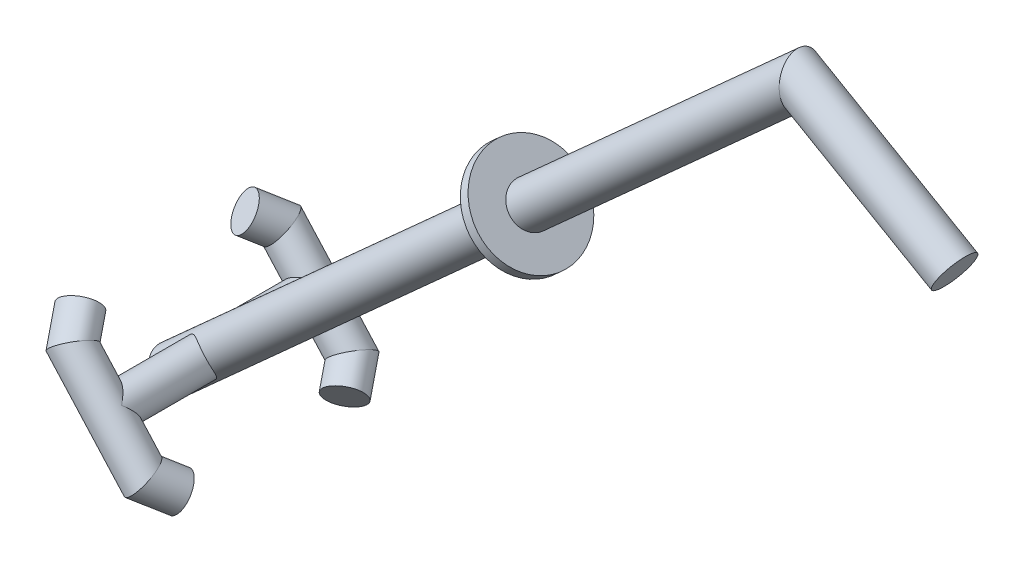
ISO-10303-21;
HEADER;
FILE_DESCRIPTION(('STEP AP214'),'2;1');
FILE_NAME('part.step','',(''),(''),'','','');
FILE_SCHEMA(('AUTOMOTIVE_DESIGN { 1 0 10303 214 1 1 1 1 }'));
ENDSEC;
DATA;
#1=APPLICATION_CONTEXT('core data for automotive mechanical design processes');
#2=APPLICATION_PROTOCOL_DEFINITION('international standard','automotive_design',2000,#1);
#3=PRODUCT_CONTEXT('',#1,'mechanical');
#4=PRODUCT('Part','Part','',(#3));
#5=PRODUCT_RELATED_PRODUCT_CATEGORY('part','',(#4));
#6=PRODUCT_DEFINITION_FORMATION('','',#4);
#7=PRODUCT_DEFINITION_CONTEXT('part definition',#1,'design');
#8=PRODUCT_DEFINITION('design','',#6,#7);
#9=PRODUCT_DEFINITION_SHAPE('','',#8);
#10=(LENGTH_UNIT() NAMED_UNIT(*) SI_UNIT(.MILLI.,.METRE.));
#11=(NAMED_UNIT(*) PLANE_ANGLE_UNIT() SI_UNIT($,.RADIAN.));
#12=(NAMED_UNIT(*) SI_UNIT($,.STERADIAN.) SOLID_ANGLE_UNIT());
#13=UNCERTAINTY_MEASURE_WITH_UNIT(LENGTH_MEASURE(1.E-05),#10,'distance_accuracy_value','');
#14=(GEOMETRIC_REPRESENTATION_CONTEXT(3) GLOBAL_UNCERTAINTY_ASSIGNED_CONTEXT((#13)) GLOBAL_UNIT_ASSIGNED_CONTEXT((#10,
#11,#12)) REPRESENTATION_CONTEXT('',''));
#15=CARTESIAN_POINT('',(0.,0.,0.));
#16=DIRECTION('',(0.,0.,1.));
#17=DIRECTION('',(1.,0.,0.));
#18=AXIS2_PLACEMENT_3D('',#15,#16,#17);
#19=CARTESIAN_POINT('',(249.156194685657,-78.6897357516122,0.));
#20=DIRECTION('',(0.743144825477398,0.669130606358854,0.));
#21=DIRECTION('',(-0.669130606358854,0.743144825477398,0.));
#22=AXIS2_PLACEMENT_3D('',#19,#20,#21);
#23=CYLINDRICAL_SURFACE('',#22,5.08);
#24=CARTESIAN_POINT('',(254.14913396922,-70.1917770508547,-4.11825515178776));
#25=CARTESIAN_POINT('',(254.149132988899,-70.4074317057948,-4.23399544106983));
#26=CARTESIAN_POINT('',(254.164807636791,-70.6261064364632,-4.3446819852995));
#27=CARTESIAN_POINT('',(254.23035109162,-71.0663901495953,-4.54956521334691));
#28=CARTESIAN_POINT('',(254.280237531761,-71.2880005873697,-4.64375336223393));
#29=CARTESIAN_POINT('',(254.406429938335,-71.6948219241537,-4.79613185379303));
#30=CARTESIAN_POINT('',(254.477475421224,-71.8803759449182,-4.85763355457012));
#31=CARTESIAN_POINT('',(254.604189290274,-72.1535314963265,-4.93432223758972));
#32=CARTESIAN_POINT('',(254.649788365544,-72.2437262923023,-4.95729211170676));
#33=CARTESIAN_POINT('',(254.747620127543,-72.4217209792447,-4.99763098139129));
#34=CARTESIAN_POINT('',(254.799849944904,-72.5095218862894,-5.01500238818462));
#35=CARTESIAN_POINT('',(254.911078754514,-72.6825141309198,-5.04387104270019));
#36=CARTESIAN_POINT('',(254.970117095992,-72.7676862826187,-5.05533181093221));
#37=CARTESIAN_POINT('',(255.094310882622,-72.934044596028,-5.0719590733311));
#38=CARTESIAN_POINT('',(255.159463687426,-73.0152324553805,-5.07712827097643));
#39=CARTESIAN_POINT('',(255.295405910486,-73.1729272994705,-5.08106003411351));
#40=CARTESIAN_POINT('',(255.366196055197,-73.2494336786769,-5.07982177259039));
#41=CARTESIAN_POINT('',(255.512772512572,-73.3970942734688,-5.07096634345174));
#42=CARTESIAN_POINT('',(255.588558535218,-73.4682487992235,-5.06334954581816));
#43=CARTESIAN_POINT('',(255.737369494736,-73.5985050226701,-5.04288271325791));
#44=CARTESIAN_POINT('',(255.810024685655,-73.6581148089143,-5.03056801628613));
#45=CARTESIAN_POINT('',(255.958331321872,-73.7721871008314,-5.00103688061268));
#46=CARTESIAN_POINT('',(256.033983747937,-73.8266479015565,-4.98381882581545));
#47=CARTESIAN_POINT('',(256.264562663344,-73.9819465653856,-4.92523611552475));
#48=CARTESIAN_POINT('',(256.423217065309,-74.0747929939041,-4.87692774682119));
#49=CARTESIAN_POINT('',(256.756960385078,-74.243965662488,-4.76097034074065));
#50=CARTESIAN_POINT('',(256.93243578093,-74.3187538594382,-4.69223595786027));
#51=CARTESIAN_POINT('',(257.285935834682,-74.4440493644646,-4.54086452555146));
#52=CARTESIAN_POINT('',(257.463960747671,-74.4945542251732,-4.45822607595045));
#53=CARTESIAN_POINT('',(257.776750088814,-74.563160005285,-4.30402267533324));
#54=CARTESIAN_POINT('',(257.91155814028,-74.586144830742,-4.2346172812231));
#55=CARTESIAN_POINT('',(258.18041779808,-74.6195543531291,-4.09144367080898));
#56=CARTESIAN_POINT('',(258.314469342059,-74.6299780293386,-4.01767510046362));
#57=CARTESIAN_POINT('',(258.582035188189,-74.6387870824467,-3.86687145047695));
#58=CARTESIAN_POINT('',(258.715542842412,-74.6371081464349,-3.7898210861157));
#59=CARTESIAN_POINT('',(258.981029772626,-74.6219023581932,-3.63441514086541));
#60=CARTESIAN_POINT('',(259.113009663555,-74.6083804536884,-3.55606011844181));
#61=CARTESIAN_POINT('',(259.378537289264,-74.5691246180855,-3.39795716931252));
#62=CARTESIAN_POINT('',(259.51205022472,-74.5431142993743,-3.31821916821371));
#63=CARTESIAN_POINT('',(259.777815060045,-74.4784597500726,-3.16147818485084));
#64=CARTESIAN_POINT('',(259.910065760249,-74.4398045349502,-3.08447764530976));
#65=CARTESIAN_POINT('',(260.172552784568,-74.3493926303415,-2.9370718973869));
#66=CARTESIAN_POINT('',(260.302796695252,-74.2977270793926,-2.86662529499108));
#67=CARTESIAN_POINT('',(260.562023717683,-74.1799645353021,-2.7366248519071));
#68=CARTESIAN_POINT('',(260.691008992462,-74.1138999626924,-2.67704708404071));
#69=CARTESIAN_POINT('',(260.929117401082,-73.9762208654124,-2.58266629456664));
#70=CARTESIAN_POINT('',(261.038491638038,-73.9066803960708,-2.5455617942469));
#71=CARTESIAN_POINT('',(261.253559322388,-73.7558502421392,-2.48981447264341));
#72=CARTESIAN_POINT('',(261.359263264086,-73.6745981968334,-2.47111395611796));
#73=CARTESIAN_POINT('',(261.564507711166,-73.5013122846726,-2.4556901934592));
#74=CARTESIAN_POINT('',(261.664002968959,-73.4092108428092,-2.45911270736234));
#75=CARTESIAN_POINT('',(261.852749329802,-73.2179308548708,-2.4875366217293));
#76=CARTESIAN_POINT('',(261.941977071841,-73.1187369712894,-2.51258617000328));
#77=CARTESIAN_POINT('',(262.137009130123,-72.8819455955973,-2.59106141318792));
#78=CARTESIAN_POINT('',(262.238081000754,-72.7427931577978,-2.65125302515248));
#79=CARTESIAN_POINT('',(262.420306023352,-72.4604520208135,-2.78984346841959));
#80=CARTESIAN_POINT('',(262.501386648994,-72.3172506667445,-2.86830664290075));
#81=CARTESIAN_POINT('',(262.635665113439,-72.0474396123349,-3.02334003538388));
#82=CARTESIAN_POINT('',(262.691161734895,-71.9212471777446,-3.09869468336642));
#83=CARTESIAN_POINT('',(262.7897184395,-71.6661612150275,-3.25302738685918));
#84=CARTESIAN_POINT('',(262.832770530119,-71.5372660077751,-3.33200773342121));
#85=CARTESIAN_POINT('',(262.906877949824,-71.2765125368304,-3.49110215910325));
#86=CARTESIAN_POINT('',(262.937916804624,-71.1446504647414,-3.57121764001123));
#87=CARTESIAN_POINT('',(262.987917050968,-70.8781235265312,-3.73048760870868));
#88=CARTESIAN_POINT('',(263.006881367221,-70.743459347307,-3.80964232465566));
#89=CARTESIAN_POINT('',(263.032867404201,-70.4667800330887,-3.96797751638083));
#90=CARTESIAN_POINT('',(263.039458669633,-70.3246709811525,-4.047066356909));
#91=CARTESIAN_POINT('',(263.038784636023,-70.037955361176,-4.20066571228135));
#92=CARTESIAN_POINT('',(263.031516079802,-69.893348213976,-4.27517514667779));
#93=CARTESIAN_POINT('',(263.002359283144,-69.6028899016629,-4.4175606618774));
#94=CARTESIAN_POINT('',(262.980519810637,-69.4570444832327,-4.48545800710331));
#95=CARTESIAN_POINT('',(262.921476146639,-69.1649637104576,-4.61296441578527));
#96=CARTESIAN_POINT('',(262.884283055522,-69.0187287135039,-4.67257942567887));
#97=CARTESIAN_POINT('',(262.78169046527,-68.6885984859833,-4.79611722464422));
#98=CARTESIAN_POINT('',(262.711428815208,-68.5049895410364,-4.85699723798752));
#99=CARTESIAN_POINT('',(262.586319294166,-68.2346388324491,-4.93308843013626));
#100=CARTESIAN_POINT('',(262.541319791724,-68.1453496576645,-4.95591683762551));
#101=CARTESIAN_POINT('',(262.444821571819,-67.9690979726654,-4.99609946976974));
#102=CARTESIAN_POINT('',(262.393325827991,-67.88213441984,-5.01345618643544));
#103=CARTESIAN_POINT('',(262.283706640348,-67.7107510213264,-5.042426523574));
#104=CARTESIAN_POINT('',(262.225546026034,-67.6263491275394,-5.05400579423735));
#105=CARTESIAN_POINT('',(262.103217322685,-67.4614118041529,-5.07101229641382));
#106=CARTESIAN_POINT('',(262.039051722828,-67.3808747932474,-5.07644206488803));
#107=CARTESIAN_POINT('',(261.905175519398,-67.2243478982543,-5.08103330442304));
#108=CARTESIAN_POINT('',(261.835464480749,-67.148358371768,-5.08019428317529));
#109=CARTESIAN_POINT('',(261.691108446513,-67.0015780107808,-5.07226666301542));
#110=CARTESIAN_POINT('',(261.616463693191,-66.9307869213739,-5.06517837075919));
#111=CARTESIAN_POINT('',(261.469102557252,-66.800396115456,-5.04572849160121));
#112=CARTESIAN_POINT('',(261.396714331204,-66.7403542307955,-5.0338371313628));
#113=CARTESIAN_POINT('',(261.248893415194,-66.6253980619588,-5.00512939151086));
#114=CARTESIAN_POINT('',(261.173459714131,-66.5704855011119,-4.9883113644493));
#115=CARTESIAN_POINT('',(260.943462773394,-66.4138131095829,-4.93088448329863));
#116=CARTESIAN_POINT('',(260.785100254932,-66.3200277364409,-4.88328864656311));
#117=CARTESIAN_POINT('',(260.452323764556,-66.1491987479334,-4.76884415678657));
#118=CARTESIAN_POINT('',(260.277532195739,-66.0736177990578,-4.70095505428218));
#119=CARTESIAN_POINT('',(259.925269918609,-65.9466424706373,-4.55119150054139));
#120=CARTESIAN_POINT('',(259.747798838019,-65.8952514844353,-4.46931508937414));
#121=CARTESIAN_POINT('',(259.43606547122,-65.8250678913967,-4.31644299098918));
#122=CARTESIAN_POINT('',(259.301779510705,-65.8013890721528,-4.24763570584447));
#123=CARTESIAN_POINT('',(259.033919652665,-65.7665254280234,-4.10560003140522));
#124=CARTESIAN_POINT('',(258.90034581419,-65.7553416236882,-4.03237128149527));
#125=CARTESIAN_POINT('',(258.633743455935,-65.7449412266344,-3.88259522111527));
#126=CARTESIAN_POINT('',(258.500721057382,-65.7457851038745,-3.80603307276504));
#127=CARTESIAN_POINT('',(258.236182496425,-65.7592347609078,-3.65149954236488));
#128=CARTESIAN_POINT('',(258.104665736212,-65.7718356961724,-3.57352875372511));
#129=CARTESIAN_POINT('',(257.840100329678,-65.8091157995216,-3.41607361830572));
#130=CARTESIAN_POINT('',(257.707085937286,-65.8340658844602,-3.33659566721231));
#131=CARTESIAN_POINT('',(257.442332375879,-65.8964429593232,-3.18014441247313));
#132=CARTESIAN_POINT('',(257.310594335945,-65.9338801132026,-3.10317320541633));
#133=CARTESIAN_POINT('',(257.049060604114,-66.0216819909266,-2.9554077747782));
#134=CARTESIAN_POINT('',(256.919257928806,-66.0719649124594,-2.88457812990505));
#135=CARTESIAN_POINT('',(256.660875741776,-66.1867219753314,-2.75322267207899));
#136=CARTESIAN_POINT('',(256.532294250761,-66.2511664510837,-2.69267578203751));
#137=CARTESIAN_POINT('',(256.293783804436,-66.3861765769136,-2.59528661043645));
#138=CARTESIAN_POINT('',(256.183638140403,-66.4548037681968,-2.55636776776374));
#139=CARTESIAN_POINT('',(255.966784168669,-66.6039833088675,-2.49665315582505));
#140=CARTESIAN_POINT('',(255.860066080076,-66.684497205065,-2.47580038418728));
#141=CARTESIAN_POINT('',(255.652358512358,-66.8567690747151,-2.45607512543866));
#142=CARTESIAN_POINT('',(255.551419290236,-66.9486086086704,-2.45737257634522));
#143=CARTESIAN_POINT('',(255.35969675135,-67.1397517425698,-2.48208887846352));
#144=CARTESIAN_POINT('',(255.268933134237,-67.2390692190518,-2.5055498375724));
#145=CARTESIAN_POINT('',(255.073494482125,-67.4727808769762,-2.57992768124749));
#146=CARTESIAN_POINT('',(254.973027661746,-67.6086295755826,-2.6370386741371));
#147=CARTESIAN_POINT('',(254.791285495913,-67.8844238428841,-2.76963599451193));
#148=CARTESIAN_POINT('',(254.710093694753,-68.0243843938411,-2.84519953360158));
#149=CARTESIAN_POINT('',(254.574607295624,-68.2890134284908,-2.99568122588813));
#150=CARTESIAN_POINT('',(254.518187430587,-68.4133017251703,-3.06940371437138));
#151=CARTESIAN_POINT('',(254.417557102453,-68.664506248945,-3.2207885622279));
#152=CARTESIAN_POINT('',(254.373356211788,-68.7914244531327,-3.2984539544423));
#153=CARTESIAN_POINT('',(254.296821291061,-69.0476777531446,-3.45493189409164));
#154=CARTESIAN_POINT('',(254.264461868656,-69.1770070449287,-3.53374160561353));
#155=CARTESIAN_POINT('',(254.211428785008,-69.4383326849929,-3.69068408481777));
#156=CARTESIAN_POINT('',(254.190746588806,-69.570327012102,-3.76881730571386));
#157=CARTESIAN_POINT('',(254.167133399462,-69.7840597143375,-3.89226182876939));
#158=CARTESIAN_POINT('',(254.160415494462,-69.8649712535567,-3.93830234650557));
#159=CARTESIAN_POINT('',(254.151415379655,-70.0277009248364,-4.02922559110284));
#160=CARTESIAN_POINT('',(254.149134343146,-70.1095192909499,-4.07410800861706));
#161=CARTESIAN_POINT('',(254.14913396922,-70.1917770508547,-4.11825515178776));
#162=B_SPLINE_CURVE_WITH_KNOTS('',3,(#24,#25,#26,#27,#28,#29,#30,#31,#32,#33,#34,#35,#36,#37,
#38,#39,#40,#41,#42,#43,#44,#45,#46,#47,#48,#49,#50,#51,#52,#53,#54,#55,#56,#57,#58,#59,#60,#61,
#62,#63,#64,#65,#66,#67,#68,#69,#70,#71,#72,#73,#74,#75,#76,#77,#78,#79,#80,#81,#82,#83,#84,#85,
#86,#87,#88,#89,#90,#91,#92,#93,#94,#95,#96,#97,#98,#99,#100,#101,#102,#103,#104,#105,#106,#107,
#108,#109,#110,#111,#112,#113,#114,#115,#116,#117,#118,#119,#120,#121,#122,#123,#124,#125,#126,
#127,#128,#129,#130,#131,#132,#133,#134,#135,#136,#137,#138,#139,#140,#141,#142,#143,#144,#145,
#146,#147,#148,#149,#150,#151,#152,#153,#154,#155,#156,#157,#158,#159,#160,#161),.UNSPECIFIED.,
.T.,.F.,(4,2,2,2,2,2,2,2,2,2,2,2,2,2,2,2,2,2,2,2,2,2,2,2,2,2,2,2,2,2,2,2,2,2,2,2,2,2,2,2,2,2,2,
2,2,2,2,2,2,2,2,2,2,2,2,2,2,2,2,2,2,2,2,2,2,2,2,2,4),(0.,0.733990146966119,1.46835888660772,
2.08948075071323,2.40008086523608,2.71054702684568,3.02290706927141,3.33513284361573,
3.6473989181471,3.95964688118591,4.2436672686794,4.52778137488264,5.09558974906912,
5.701723211818,6.30791775022142,6.76741938487248,7.2269583561689,7.68894109675736,
8.1507309233956,8.62324809182774,9.09617682749158,9.56588058700817,10.0345375001832,
10.437539651666,10.8392743555749,11.2436586187551,11.6489454823455,12.1925226937883,
12.738043855955,13.2087666063809,13.6797910112575,14.1514590834003,14.6230128640226,
15.1106879820713,15.5984777221067,16.0846429964925,16.5704573965552,17.184974741478,
17.4923472115677,17.7995794899266,18.1086172766732,18.4175275241927,18.7264620316983,
19.0353813804255,19.3194427131731,19.6035991429798,20.1715016447321,20.7758890552224,
21.3803612233041,21.8379947997396,22.295665751398,22.7556384819644,23.2154217631517,
23.6857713987629,24.1565048174992,24.6243122270545,25.0911488613091,25.4962101754357,
25.8999887294904,26.306866482902,26.7145188111379,27.2465828676837,27.7809125982518,
28.2457080445605,28.7108665896619,29.1750217408827,29.6388371974974,29.918731112026,
30.1986990324882),.UNSPECIFIED.);
#163=CARTESIAN_POINT('',(254.14913396922,-70.1917770508547,-4.11825515178776));
#164=VERTEX_POINT('',#163);
#165=EDGE_CURVE('E88',#164,#164,#162,.T.);
#166=ORIENTED_EDGE('',*,*,#165,.T.);
#167=EDGE_LOOP('',(#166));
#168=FACE_BOUND('',#167,.T.);
#169=CARTESIAN_POINT('',(334.097648237723,-2.20810744479509,0.));
#170=DIRECTION('',(-0.743144825477398,-0.669130606358854,0.));
#171=DIRECTION('',(0.669130606358854,-0.743144825477398,0.));
#172=AXIS2_PLACEMENT_3D('',#169,#170,#171);
#173=CIRCLE('',#172,5.08);
#174=CARTESIAN_POINT('',(337.496831718026,-5.98328315822027,0.));
#175=VERTEX_POINT('',#174);
#176=EDGE_CURVE('E111',#175,#175,#173,.F.);
#177=ORIENTED_EDGE('',*,*,#176,.F.);
#178=EDGE_LOOP('',(#177));
#179=FACE_BOUND('',#178,.T.);
#180=CARTESIAN_POINT('',(249.156194685657,-78.6897357516122,0.));
#181=DIRECTION('',(0.743144825477398,0.669130606358854,0.));
#182=DIRECTION('',(-0.669130606358854,0.743144825477398,0.));
#183=AXIS2_PLACEMENT_3D('',#180,#181,#182);
#184=CIRCLE('',#183,5.08);
#185=CARTESIAN_POINT('',(245.757011205354,-74.914560038187,0.));
#186=VERTEX_POINT('',#185);
#187=EDGE_CURVE('E102',#186,#186,#184,.T.);
#188=ORIENTED_EDGE('',*,*,#187,.T.);
#189=EDGE_LOOP('',(#188));
#190=FACE_BOUND('',#189,.T.);
#191=CARTESIAN_POINT('',(254.14913396922,-70.1917770508547,4.11825515178776));
#192=CARTESIAN_POINT('',(254.149132562831,-70.0244706407651,4.02845819541043));
#193=CARTESIAN_POINT('',(254.158564210281,-69.8588481848945,3.9355515307606));
#194=CARTESIAN_POINT('',(254.195367007206,-69.5314311486971,3.7462530048549));
#195=CARTESIAN_POINT('',(254.22275896489,-69.3696412341719,3.64985722376463));
#196=CARTESIAN_POINT('',(254.295125418143,-69.0501030404058,3.45670833090146));
#197=CARTESIAN_POINT('',(254.340112826029,-68.8923578201329,3.35995500851739));
#198=CARTESIAN_POINT('',(254.447985363836,-68.5809990044444,3.17017455098782));
#199=CARTESIAN_POINT('',(254.510847596268,-68.427380396656,3.07714282131856));
#200=CARTESIAN_POINT('',(254.645951671081,-68.1445937513569,2.91256470409574));
#201=CARTESIAN_POINT('',(254.715729369423,-68.0149587735245,2.83982082830173));
#202=CARTESIAN_POINT('',(254.871112093056,-67.7587779938306,2.70721445058392));
#203=CARTESIAN_POINT('',(254.956675672239,-67.6322250628098,2.64731908526395));
#204=CARTESIAN_POINT('',(255.127078773068,-67.4072768049769,2.55803158855024));
#205=CARTESIAN_POINT('',(255.208933157973,-67.3081214083116,2.52499790872944));
#206=CARTESIAN_POINT('',(255.38344205164,-67.1150384583928,2.47778512127265));
#207=CARTESIAN_POINT('',(255.476073588965,-67.0211003940856,2.4635666819497));
#208=CARTESIAN_POINT('',(255.670271919178,-66.8411598548282,2.45674667095494));
#209=CARTESIAN_POINT('',(255.771874917657,-66.7551926999169,2.46423697147883));
#210=CARTESIAN_POINT('',(255.980180954119,-66.5941806624122,2.49945575524474));
#211=CARTESIAN_POINT('',(256.086893541673,-66.5191573832192,2.52722363510958));
#212=CARTESIAN_POINT('',(256.347921013297,-66.3517591598163,2.61321729600936));
#213=CARTESIAN_POINT('',(256.503368778219,-66.2653696848189,2.67934321383672));
#214=CARTESIAN_POINT('',(256.816238343898,-66.1140876550786,2.82955150527997));
#215=CARTESIAN_POINT('',(256.973665583501,-66.0492833856298,2.91370536545682));
#216=CARTESIAN_POINT('',(257.266043845461,-65.9474492045922,3.07746222100986));
#217=CARTESIAN_POINT('',(257.400774952872,-65.9076951145569,3.15581340202346));
#218=CARTESIAN_POINT('',(257.671754399216,-65.8412918148412,3.31554609312485));
#219=CARTESIAN_POINT('',(257.808003651861,-65.8146509877374,3.3969295058911));
#220=CARTESIAN_POINT('',(258.082093031773,-65.7741972404775,3.56012905412644));
#221=CARTESIAN_POINT('',(258.219932737728,-65.7603809986362,3.64194507202238));
#222=CARTESIAN_POINT('',(258.497123394075,-65.7456701074006,3.80398933965463));
#223=CARTESIAN_POINT('',(258.636473718654,-65.7447702974742,3.88421821071262));
#224=CARTESIAN_POINT('',(259.009677254965,-65.7600935996277,4.09363716727147));
#225=CARTESIAN_POINT('',(259.244826433041,-65.7880860779514,4.21995540447049));
#226=CARTESIAN_POINT('',(259.71544436014,-65.8838604527059,4.4552762773978));
#227=CARTESIAN_POINT('',(259.950911566271,-65.951563831447,4.56431254470644));
#228=CARTESIAN_POINT('',(260.367266360204,-66.1110179977002,4.73651058083457));
#229=CARTESIAN_POINT('',(260.549191749936,-66.1946861285102,4.80449747864895));
#230=CARTESIAN_POINT('',(260.815806631671,-66.3404792913797,4.8912640987162));
#231=CARTESIAN_POINT('',(260.903656577974,-66.3924763416352,4.91765597142562));
#232=CARTESIAN_POINT('',(261.076580802039,-66.5031455431853,4.96488719519569));
#233=CARTESIAN_POINT('',(261.161656266281,-66.5618147917067,4.98572894777626));
#234=CARTESIAN_POINT('',(261.328871376144,-66.6860443490624,5.02155585683822));
#235=CARTESIAN_POINT('',(261.410986630671,-66.7516495364537,5.03649948573911));
#236=CARTESIAN_POINT('',(261.570834467473,-66.888994081624,5.05998152570235));
#237=CARTESIAN_POINT('',(261.648569024496,-66.9607306381775,5.0685228445325));
#238=CARTESIAN_POINT('',(261.798929422861,-67.1098104396779,5.07900637439937));
#239=CARTESIAN_POINT('',(261.871555725685,-67.187153176875,5.08094918230007));
#240=CARTESIAN_POINT('',(262.011028121827,-67.346765508024,5.07819011005758));
#241=CARTESIAN_POINT('',(262.077874654705,-67.4290347265037,5.07348873568545));
#242=CARTESIAN_POINT('',(262.198717743463,-67.5890861711293,5.05837203983206));
#243=CARTESIAN_POINT('',(262.253329223211,-67.6664655479434,5.04859094146473));
#244=CARTESIAN_POINT('',(262.357178081106,-67.82398495739,5.02395921452845));
#245=CARTESIAN_POINT('',(262.406413773906,-67.9041258454754,5.00910700211814));
#246=CARTESIAN_POINT('',(262.54570501519,-68.1477574216115,4.95732075851606));
#247=CARTESIAN_POINT('',(262.62743798287,-68.3145814277496,4.91314481262067));
#248=CARTESIAN_POINT('',(262.77128904317,-68.6600814178656,4.80594486547958));
#249=CARTESIAN_POINT('',(262.832343629038,-68.8389510744837,4.7421537345546));
#250=CARTESIAN_POINT('',(262.930493498901,-69.1975062612183,4.60018878995742));
#251=CARTESIAN_POINT('',(262.967581646083,-69.3771920183301,4.52201070098118));
#252=CARTESIAN_POINT('',(263.012822562134,-69.6901398986602,4.37568185598623));
#253=CARTESIAN_POINT('',(263.025876383915,-69.8238386674391,4.30986941909934));
#254=CARTESIAN_POINT('',(263.0399462668,-70.0894789721856,4.17356559868829));
#255=CARTESIAN_POINT('',(263.040961354808,-70.2214203652428,4.10307383739536));
#256=CARTESIAN_POINT('',(263.031494476033,-70.4835459243553,3.95853022500082));
#257=CARTESIAN_POINT('',(263.020968650799,-70.6137214705099,3.88446582272981));
#258=CARTESIAN_POINT('',(262.988770664266,-70.871532568411,3.7344485648133));
#259=CARTESIAN_POINT('',(262.967100714771,-70.9991686189584,3.65849608674472));
#260=CARTESIAN_POINT('',(262.912213008923,-71.2546345217465,3.50454125927876));
#261=CARTESIAN_POINT('',(262.878752047127,-71.3824070448688,3.42653053013483));
#262=CARTESIAN_POINT('',(262.800262616286,-71.6354059786244,3.27201020750456));
#263=CARTESIAN_POINT('',(262.755227409803,-71.7606308602875,3.19550151637946));
#264=CARTESIAN_POINT('',(262.65328740682,-72.0081324645772,3.04688812667179));
#265=CARTESIAN_POINT('',(262.596430477697,-72.1304189233794,2.97476713912211));
#266=CARTESIAN_POINT('',(262.469836120215,-72.3725085722169,2.83829516982085));
#267=CARTESIAN_POINT('',(262.400117474364,-72.4923151036396,2.77393308116909));
#268=CARTESIAN_POINT('',(262.253101693437,-72.718946271779,2.66322335777811));
#269=CARTESIAN_POINT('',(262.176990148889,-72.8259940911809,2.6157961200825));
#270=CARTESIAN_POINT('',(262.012368108561,-73.0363221668216,2.53738781603041));
#271=CARTESIAN_POINT('',(261.923894292417,-73.1396124689533,2.50635935064629));
#272=CARTESIAN_POINT('',(261.734081847058,-73.3410701728588,2.46593494399757));
#273=CARTESIAN_POINT('',(261.632601457548,-73.4391611391186,2.4568033169072));
#274=CARTESIAN_POINT('',(261.421122420861,-73.6248515288852,2.46314271455151));
#275=CARTESIAN_POINT('',(261.311118495951,-73.7124443651295,2.47862910033621));
#276=CARTESIAN_POINT('',(261.069923696171,-73.8869017518056,2.53461655002834));
#277=CARTESIAN_POINT('',(260.938046507596,-73.9716484989239,2.57854966496938));
#278=CARTESIAN_POINT('',(260.67195207087,-74.1242592826333,2.68524837762317));
#279=CARTESIAN_POINT('',(260.537727874989,-74.1920584661001,2.7480843502327));
#280=CARTESIAN_POINT('',(260.285331321874,-74.304494395121,2.87618339007785));
#281=CARTESIAN_POINT('',(260.167282451965,-74.3509783020937,2.94012762229087));
#282=CARTESIAN_POINT('',(259.930191335122,-74.4330889589353,3.07308523325851));
#283=CARTESIAN_POINT('',(259.811148424998,-74.4687077458749,3.14210228407681));
#284=CARTESIAN_POINT('',(259.571795318331,-74.5296880913547,3.28279138612159));
#285=CARTESIAN_POINT('',(259.451483537274,-74.5550347330619,3.35446713463571));
#286=CARTESIAN_POINT('',(259.209648832828,-74.5956608850891,3.49853815745945));
#287=CARTESIAN_POINT('',(259.088126231822,-74.6109430060391,3.57093324023179));
#288=CARTESIAN_POINT('',(258.834981521259,-74.6321928271128,3.72020837779463));
#289=CARTESIAN_POINT('',(258.703263579018,-74.6374085578132,3.79703496459467));
#290=CARTESIAN_POINT('',(258.438488562907,-74.6360238491249,3.94831710359834));
#291=CARTESIAN_POINT('',(258.305431237172,-74.6294211444323,4.02277219846102));
#292=CARTESIAN_POINT('',(258.038666481555,-74.6039621536895,4.16766882297589));
#293=CARTESIAN_POINT('',(257.904961286578,-74.5851344331073,4.23811929369125));
#294=CARTESIAN_POINT('',(257.637289119832,-74.5347075692957,4.37370467915152));
#295=CARTESIAN_POINT('',(257.503322152568,-74.5031086439161,4.43883968454422));
#296=CARTESIAN_POINT('',(257.175491520435,-74.4091392596493,4.59021179978349));
#297=CARTESIAN_POINT('',(256.981882663014,-74.3393173807312,4.67270557166519));
#298=CARTESIAN_POINT('',(256.695922691932,-74.2124402515016,4.78184665297454));
#299=CARTESIAN_POINT('',(256.601317851044,-74.1664404284564,4.81580155915348));
#300=CARTESIAN_POINT('',(256.414259707147,-74.0670025265051,4.87825325299601));
#301=CARTESIAN_POINT('',(256.321805344409,-74.0135682059236,4.90675278130219));
#302=CARTESIAN_POINT('',(256.138999569538,-73.8988101290985,4.95794972289073));
#303=CARTESIAN_POINT('',(256.048674803079,-73.837419273402,4.98059222305094));
#304=CARTESIAN_POINT('',(255.87193694863,-73.707412528951,5.01920639160371));
#305=CARTESIAN_POINT('',(255.785521871861,-73.6388003739749,5.03518148637181));
#306=CARTESIAN_POINT('',(255.617507864408,-73.4947995769799,5.06007279012822));
#307=CARTESIAN_POINT('',(255.535906884859,-73.4194138527436,5.06899202242062));
#308=CARTESIAN_POINT('',(255.378364167153,-73.2624783686783,5.07954669498464));
#309=CARTESIAN_POINT('',(255.302421711029,-73.1809293935112,5.0811830608764));
#310=CARTESIAN_POINT('',(255.166346668327,-73.0233316818362,5.07739465819352));
#311=CARTESIAN_POINT('',(255.105437889025,-72.9479285041577,5.07285270429826));
#312=CARTESIAN_POINT('',(254.988889323397,-72.7936200895622,5.0583053896487));
#313=CARTESIAN_POINT('',(254.933251193245,-72.7147137632282,5.04829831825067));
#314=CARTESIAN_POINT('',(254.827587637723,-72.5540626318585,5.02301539528633));
#315=CARTESIAN_POINT('',(254.777561193146,-72.472318345803,5.0077405025346));
#316=CARTESIAN_POINT('',(254.683292392235,-72.3065932416637,4.97220865473347));
#317=CARTESIAN_POINT('',(254.639052279187,-72.2226115712741,4.95194977617623));
#318=CARTESIAN_POINT('',(254.515239645017,-71.9683201189957,4.88422507366846));
#319=CARTESIAN_POINT('',(254.444458295489,-71.7954849776703,4.82978204151757));
#320=CARTESIAN_POINT('',(254.326268610991,-71.4476325423778,4.7056253266611));
#321=CARTESIAN_POINT('',(254.27885414196,-71.272615833478,4.6359156585615));
#322=CARTESIAN_POINT('',(254.210764389152,-70.9456368450468,4.49427973475413));
#323=CARTESIAN_POINT('',(254.187444074327,-70.7935899617051,4.42377830078619));
#324=CARTESIAN_POINT('',(254.156621238017,-70.4911744093303,4.27576359215637));
#325=CARTESIAN_POINT('',(254.149135221981,-70.3408076538306,4.19824308857481));
#326=CARTESIAN_POINT('',(254.14913396922,-70.1917770508547,4.11825515178776));
#327=B_SPLINE_CURVE_WITH_KNOTS('',3,(#191,#192,#193,#194,#195,#196,#197,#198,#199,#200,#201,
#202,#203,#204,#205,#206,#207,#208,#209,#210,#211,#212,#213,#214,#215,#216,#217,#218,#219,#220,
#221,#222,#223,#224,#225,#226,#227,#228,#229,#230,#231,#232,#233,#234,#235,#236,#237,#238,#239,
#240,#241,#242,#243,#244,#245,#246,#247,#248,#249,#250,#251,#252,#253,#254,#255,#256,#257,#258,
#259,#260,#261,#262,#263,#264,#265,#266,#267,#268,#269,#270,#271,#272,#273,#274,#275,#276,#277,
#278,#279,#280,#281,#282,#283,#284,#285,#286,#287,#288,#289,#290,#291,#292,#293,#294,#295,#296,
#297,#298,#299,#300,#301,#302,#303,#304,#305,#306,#307,#308,#309,#310,#311,#312,#313,#314,#315,
#316,#317,#318,#319,#320,#321,#322,#323,#324,#325,#326),.UNSPECIFIED.,.T.,.F.,(4,2,2,2,2,2,2,2,
2,2,2,2,2,2,2,2,2,2,2,2,2,2,2,2,2,2,2,2,2,2,2,2,2,2,2,2,2,2,2,2,2,2,2,2,2,2,2,2,2,2,2,2,2,2,2,2,
2,2,2,2,2,2,2,2,2,2,2,4),(0.,0.569405456438173,1.13947177526127,1.70995722113946,
2.27971514728834,2.77143173896167,3.26187523250785,3.65861353652608,4.05452117525026,
4.45210675320384,4.85046684884251,5.41647844485795,5.98477743467548,6.46671511066687,
6.94896046368854,7.43108087585526,7.91300865996652,8.71501603610783,9.51544297731459,
10.1470645559513,10.4630533497982,10.7789051932799,11.0969428291256,11.4148359326285,
11.7327002805525,12.0505404331846,12.3358424445797,12.6212336448777,13.1915537611311,
13.7878618515955,14.3843474310899,14.832555899227,15.2808005960054,15.7307546610688,
16.1806194570281,16.6403660756575,17.1003809241252,17.5585681852598,18.0160915580758,
18.4338437976107,18.8503818690993,19.2719231586664,19.6937275831577,20.1793891939863,
20.6668817714969,21.0925393842437,21.5185082114657,21.9450934174135,22.3715679280585,
22.8288266795343,23.2861730856657,23.7424546647633,24.1987284609933,24.8609254139073,
25.1922181111212,25.5233439360121,25.8574701075976,26.1914243598934,26.5252354414643,
26.8590040959109,27.1497588683714,27.4406047025778,27.7313976268317,28.0223029555718,
28.6034745975267,29.1844935942228,29.6911718400425,30.198377980353),.UNSPECIFIED.);
#328=CARTESIAN_POINT('',(254.14913396922,-70.1917770508547,4.11825515178776));
#329=VERTEX_POINT('',#328);
#330=EDGE_CURVE('E101',#329,#329,#327,.T.);
#331=ORIENTED_EDGE('',*,*,#330,.T.);
#332=EDGE_LOOP('',(#331));
#333=FACE_BOUND('',#332,.T.);
#334=ADVANCED_FACE('F39',(#168,#179,#190,#333),#23,.T.);
#335=CARTESIAN_POINT('',(401.431983116322,58.4199999999999,0.));
#336=DIRECTION('',(0.994521895368273,0.104528463267653,0.));
#337=DIRECTION('',(-0.104528463267653,0.994521895368273,0.));
#338=AXIS2_PLACEMENT_3D('',#335,#336,#337);
#339=ELLIPSE('',#338,6.27922532569891,5.08);
#340=CARTESIAN_POINT('',(400.775625342516,64.6648270723584,0.));
#341=VERTEX_POINT('',#340);
#342=EDGE_CURVE('E106',#341,#341,#339,.F.);
#343=ORIENTED_EDGE('',*,*,#342,.T.);
#344=EDGE_LOOP('',(#343));
#345=FACE_BOUND('',#344,.T.);
#346=CARTESIAN_POINT('',(335.985236094436,-0.508515704643595,0.));
#347=DIRECTION('',(-0.743144825477398,-0.669130606358854,0.));
#348=DIRECTION('',(0.669130606358854,-0.743144825477398,0.));
#349=AXIS2_PLACEMENT_3D('',#346,#347,#348);
#350=CIRCLE('',#349,5.08);
#351=CARTESIAN_POINT('',(339.384419574739,-4.28369141806878,0.));
#352=VERTEX_POINT('',#351);
#353=EDGE_CURVE('E96',#352,#352,#350,.F.);
#354=ORIENTED_EDGE('',*,*,#353,.T.);
#355=EDGE_LOOP('',(#354));
#356=FACE_BOUND('',#355,.T.);
#357=ADVANCED_FACE('F160',(#345,#356),#23,.T.);
#358=CARTESIAN_POINT('',(438.948942503816,36.7595733984546,0.));
#359=DIRECTION('',(0.866025403784441,-0.499999999999995,0.));
#360=DIRECTION('',(0.499999999999995,0.866025403784441,0.));
#361=AXIS2_PLACEMENT_3D('',#358,#359,#360);
#362=PLANE('',#361);
#363=CARTESIAN_POINT('',(438.948942503816,36.7595733984546,0.));
#364=DIRECTION('',(0.866025403784441,-0.499999999999995,0.));
#365=DIRECTION('',(0.499999999999995,0.866025403784441,0.));
#366=AXIS2_PLACEMENT_3D('',#363,#364,#365);
#367=CIRCLE('',#366,5.08);
#368=CARTESIAN_POINT('',(441.488942503816,41.1589824496796,0.));
#369=VERTEX_POINT('',#368);
#370=EDGE_CURVE('E107',#369,#369,#367,.T.);
#371=ORIENTED_EDGE('',*,*,#370,.T.);
#372=EDGE_LOOP('',(#371));
#373=FACE_BOUND('',#372,.T.);
#374=ADVANCED_FACE('F41',(#373),#362,.T.);
#375=CARTESIAN_POINT('',(397.829387024757,60.4999598232469,0.));
#376=DIRECTION('',(0.866025403784441,-0.499999999999995,0.));
#377=DIRECTION('',(0.499999999999995,0.866025403784441,0.));
#378=AXIS2_PLACEMENT_3D('',#375,#376,#377);
#379=CYLINDRICAL_SURFACE('',#378,5.08);
#380=ORIENTED_EDGE('',*,*,#342,.F.);
#381=EDGE_LOOP('',(#380));
#382=FACE_BOUND('',#381,.T.);
#383=ORIENTED_EDGE('',*,*,#370,.F.);
#384=EDGE_LOOP('',(#383));
#385=FACE_BOUND('',#384,.T.);
#386=ADVANCED_FACE('F154',(#382,#385),#379,.T.);
#387=CARTESIAN_POINT('',(334.097648237723,-2.20810744479499,0.));
#388=DIRECTION('',(0.743144825477398,0.669130606358854,0.));
#389=DIRECTION('',(-0.669130606358854,0.743144825477398,0.));
#390=AXIS2_PLACEMENT_3D('',#387,#388,#389);
#391=CYLINDRICAL_SURFACE('',#390,12.7);
#392=CARTESIAN_POINT('',(334.097648237723,-2.20810744479499,0.));
#393=DIRECTION('',(-0.743144825477398,-0.669130606358854,0.));
#394=DIRECTION('',(0.669130606358854,-0.743144825477398,0.));
#395=AXIS2_PLACEMENT_3D('',#392,#393,#394);
#396=CIRCLE('',#395,12.7);
#397=CARTESIAN_POINT('',(342.595606938481,-11.6460467283579,0.));
#398=VERTEX_POINT('',#397);
#399=EDGE_CURVE('E92',#398,#398,#396,.T.);
#400=ORIENTED_EDGE('',*,*,#399,.F.);
#401=EDGE_LOOP('',(#400));
#402=FACE_BOUND('',#401,.T.);
#403=CARTESIAN_POINT('',(335.985236094436,-0.508515704643497,0.));
#404=DIRECTION('',(-0.743144825477398,-0.669130606358854,0.));
#405=DIRECTION('',(0.669130606358854,-0.743144825477398,0.));
#406=AXIS2_PLACEMENT_3D('',#403,#404,#405);
#407=CIRCLE('',#406,12.7);
#408=CARTESIAN_POINT('',(344.483194795193,-9.94645498820645,0.));
#409=VERTEX_POINT('',#408);
#410=EDGE_CURVE('E97',#409,#409,#407,.T.);
#411=ORIENTED_EDGE('',*,*,#410,.T.);
#412=EDGE_LOOP('',(#411));
#413=FACE_BOUND('',#412,.T.);
#414=ADVANCED_FACE('F149',(#402,#413),#391,.T.);
#415=CARTESIAN_POINT('',(334.097648237723,-2.20810744479499,0.));
#416=DIRECTION('',(-0.743144825477398,-0.669130606358854,0.));
#417=DIRECTION('',(0.669130606358854,-0.743144825477398,0.));
#418=AXIS2_PLACEMENT_3D('',#415,#416,#417);
#419=PLANE('',#418);
#420=ORIENTED_EDGE('',*,*,#176,.T.);
#421=EDGE_LOOP('',(#420));
#422=FACE_BOUND('',#421,.T.);
#423=ORIENTED_EDGE('',*,*,#399,.T.);
#424=EDGE_LOOP('',(#423));
#425=FACE_BOUND('',#424,.T.);
#426=ADVANCED_FACE('F144',(#422,#425),#419,.T.);
#427=CARTESIAN_POINT('',(335.985236094436,-0.508515704643497,0.));
#428=DIRECTION('',(-0.743144825477398,-0.669130606358854,0.));
#429=DIRECTION('',(0.669130606358854,-0.743144825477398,0.));
#430=AXIS2_PLACEMENT_3D('',#427,#428,#429);
#431=PLANE('',#430);
#432=ORIENTED_EDGE('',*,*,#353,.F.);
#433=EDGE_LOOP('',(#432));
#434=FACE_BOUND('',#433,.T.);
#435=ORIENTED_EDGE('',*,*,#410,.F.);
#436=EDGE_LOOP('',(#435));
#437=FACE_BOUND('',#436,.T.);
#438=ADVANCED_FACE('F148',(#434,#437),#431,.F.);
#439=CARTESIAN_POINT('',(249.156194685657,-78.6897357516122,0.));
#440=DIRECTION('',(0.743144825477398,0.669130606358854,0.));
#441=DIRECTION('',(-0.669130606358854,0.743144825477398,0.));
#442=AXIS2_PLACEMENT_3D('',#439,#440,#441);
#443=PLANE('',#442);
#444=ORIENTED_EDGE('',*,*,#187,.F.);
#445=EDGE_LOOP('',(#444));
#446=FACE_BOUND('',#445,.T.);
#447=ADVANCED_FACE('F140',(#446),#443,.F.);
#448=CARTESIAN_POINT('',(258.59413396922,-70.1917770508547,25.4));
#449=DIRECTION('',(0.,0.,-1.));
#450=DIRECTION('',(-1.,0.,0.));
#451=AXIS2_PLACEMENT_3D('',#448,#449,#450);
#452=CYLINDRICAL_SURFACE('',#451,4.445);
#453=ORIENTED_EDGE('',*,*,#165,.F.);
#454=EDGE_LOOP('',(#453));
#455=FACE_BOUND('',#454,.T.);
#456=CARTESIAN_POINT('',(258.59413396922,-70.1917770508546,-25.4));
#457=DIRECTION('',(0.473146789255813,-0.525482745498761,-0.707106781186547));
#458=DIRECTION('',(-0.473146789255813,0.525482745498761,-0.707106781186547));
#459=AXIS2_PLACEMENT_3D('',#456,#457,#458);
#460=ELLIPSE('',#459,6.28617928474841,4.445);
#461=CARTESIAN_POINT('',(255.290855219973,-73.1660625961198,-25.4));
#462=VERTEX_POINT('',#461);
#463=CARTESIAN_POINT('',(261.897412718467,-67.2174915055896,-25.4));
#464=VERTEX_POINT('',#463);
#465=EDGE_CURVE('E48',#462,#464,#460,.F.);
#466=ORIENTED_EDGE('',*,*,#465,.T.);
#467=CARTESIAN_POINT('',(258.59413396922,-70.1917770508546,-25.4));
#468=DIRECTION('',(-0.473146789255813,0.525482745498761,-0.707106781186547));
#469=DIRECTION('',(0.473146789255813,-0.525482745498761,-0.707106781186547));
#470=AXIS2_PLACEMENT_3D('',#467,#468,#469);
#471=ELLIPSE('',#470,6.28617928474841,4.445);
#472=EDGE_CURVE('E11',#464,#462,#471,.F.);
#473=ORIENTED_EDGE('',*,*,#472,.T.);
#474=EDGE_LOOP('',(#466,#473));
#475=FACE_BOUND('',#474,.T.);
#476=ADVANCED_FACE('F135',(#455,#475),#452,.T.);
#477=ORIENTED_EDGE('',*,*,#330,.F.);
#478=EDGE_LOOP('',(#477));
#479=FACE_BOUND('',#478,.T.);
#480=CARTESIAN_POINT('',(258.59413396922,-70.1917770508546,25.4));
#481=DIRECTION('',(0.473146789255813,-0.525482745498761,-0.707106781186547));
#482=DIRECTION('',(-0.473146789255813,0.525482745498761,-0.707106781186547));
#483=AXIS2_PLACEMENT_3D('',#480,#481,#482);
#484=ELLIPSE('',#483,6.28617928474841,4.445);
#485=CARTESIAN_POINT('',(255.290855219973,-73.1660625961197,25.4));
#486=VERTEX_POINT('',#485);
#487=CARTESIAN_POINT('',(261.897412718467,-67.2174915055895,25.4));
#488=VERTEX_POINT('',#487);
#489=EDGE_CURVE('E64',#486,#488,#484,.T.);
#490=ORIENTED_EDGE('',*,*,#489,.T.);
#491=CARTESIAN_POINT('',(258.59413396922,-70.1917770508546,25.4));
#492=DIRECTION('',(-0.473146789255813,0.525482745498761,-0.707106781186547));
#493=DIRECTION('',(0.473146789255813,-0.525482745498761,-0.707106781186547));
#494=AXIS2_PLACEMENT_3D('',#491,#492,#493);
#495=ELLIPSE('',#494,6.28617928474841,4.445);
#496=EDGE_CURVE('E54',#488,#486,#495,.T.);
#497=ORIENTED_EDGE('',*,*,#496,.T.);
#498=EDGE_LOOP('',(#490,#497));
#499=FACE_BOUND('',#498,.T.);
#500=ADVANCED_FACE('F70',(#479,#499),#452,.T.);
#501=CARTESIAN_POINT('',(269.757813732114,-82.5902995070703,-25.4));
#502=DIRECTION('',(-0.669130606358855,0.743144825477397,0.));
#503=DIRECTION('',(-0.743144825477397,-0.669130606358855,0.));
#504=AXIS2_PLACEMENT_3D('',#501,#502,#503);
#505=CYLINDRICAL_SURFACE('',#504,4.44500000000001);
#506=CARTESIAN_POINT('',(250.096175268462,-60.7538377672917,-25.4));
#507=DIRECTION('',(-0.618196071791813,0.686576293950241,0.382683432365087));
#508=DIRECTION('',(-0.256065197141939,0.284389212558044,-0.923879532511288));
#509=AXIS2_PLACEMENT_3D('',#506,#507,#508);
#510=ELLIPSE('',#509,4.8112333302997,4.44500000000001);
#511=CARTESIAN_POINT('',(248.864185857243,-59.3855749090548,-29.845));
#512=VERTEX_POINT('',#511);
#513=EDGE_CURVE('E76',#512,#512,#510,.F.);
#514=ORIENTED_EDGE('',*,*,#513,.T.);
#515=EDGE_LOOP('',(#514));
#516=FACE_BOUND('',#515,.T.);
#517=CARTESIAN_POINT('',(267.092092669977,-79.6297163344176,-25.4));
#518=DIRECTION('',(-0.618196071791811,0.68657629395024,-0.382683432365091));
#519=DIRECTION('',(0.256065197141945,-0.284389212558044,-0.923879532511286));
#520=AXIS2_PLACEMENT_3D('',#517,#518,#519);
#521=ELLIPSE('',#520,4.81123333029971,4.44500000000001);
#522=CARTESIAN_POINT('',(268.324082081196,-80.9979791926545,-29.845));
#523=VERTEX_POINT('',#522);
#524=EDGE_CURVE('E84',#523,#523,#521,.F.);
#525=ORIENTED_EDGE('',*,*,#524,.F.);
#526=EDGE_LOOP('',(#525));
#527=FACE_BOUND('',#526,.T.);
#528=ORIENTED_EDGE('',*,*,#472,.F.);
#529=ORIENTED_EDGE('',*,*,#465,.F.);
#530=EDGE_LOOP('',(#528,#529));
#531=FACE_BOUND('',#530,.T.);
#532=ADVANCED_FACE('F183',(#516,#527,#531),#505,.T.);
#533=CARTESIAN_POINT('',(246.490796734333,-56.7496592465911,-20.0118463273586));
#534=DIRECTION('',(-0.473146789255815,0.525482745498764,0.707106781186544));
#535=DIRECTION('',(0.,-0.802633301643356,0.596472784872105));
#536=AXIS2_PLACEMENT_3D('',#533,#534,#535);
#537=PLANE('',#536);
#538=CARTESIAN_POINT('',(246.490796734333,-56.7496592465911,-20.0118463273586));
#539=DIRECTION('',(-0.473146789255815,0.525482745498764,0.707106781186544));
#540=DIRECTION('',(0.,-0.802633301643356,0.596472784872105));
#541=AXIS2_PLACEMENT_3D('',#538,#539,#540);
#542=CIRCLE('',#541,4.44500000000001);
#543=CARTESIAN_POINT('',(246.490796734333,-60.3173642723958,-17.360524798602));
#544=VERTEX_POINT('',#543);
#545=EDGE_CURVE('E72',#544,#544,#542,.T.);
#546=ORIENTED_EDGE('',*,*,#545,.T.);
#547=EDGE_LOOP('',(#546));
#548=FACE_BOUND('',#547,.T.);
#549=ADVANCED_FACE('F142',(#548),#537,.T.);
#550=CARTESIAN_POINT('',(270.697471204106,-83.6338948551182,-20.0118463273585));
#551=DIRECTION('',(-0.473146789255809,0.525482745498763,-0.707106781186549));
#552=DIRECTION('',(-0.798236392436048,0.0838980255882358,0.596472784872101));
#553=AXIS2_PLACEMENT_3D('',#550,#551,#552);
#554=PLANE('',#553);
#555=CARTESIAN_POINT('',(270.697471204106,-83.6338948551182,-20.0118463273585));
#556=DIRECTION('',(-0.473146789255809,0.525482745498763,-0.707106781186549));
#557=DIRECTION('',(-0.798236392436048,0.0838980255882358,0.596472784872101));
#558=AXIS2_PLACEMENT_3D('',#555,#556,#557);
#559=CIRCLE('',#558,4.44500000000001);
#560=CARTESIAN_POINT('',(267.149310439728,-83.2609681313785,-17.360524798602));
#561=VERTEX_POINT('',#560);
#562=EDGE_CURVE('E80',#561,#561,#559,.T.);
#563=ORIENTED_EDGE('',*,*,#562,.F.);
#564=EDGE_LOOP('',(#563));
#565=FACE_BOUND('',#564,.T.);
#566=ADVANCED_FACE('F192',(#565),#554,.F.);
#567=CARTESIAN_POINT('',(251.981124708251,-62.8472862049412,-28.2170127354445));
#568=DIRECTION('',(-0.473146789255815,0.525482745498765,0.707106781186543));
#569=DIRECTION('',(0.,-0.802633301643356,0.596472784872107));
#570=AXIS2_PLACEMENT_3D('',#567,#568,#569);
#571=CYLINDRICAL_SURFACE('',#570,4.44500000000001);
#572=ORIENTED_EDGE('',*,*,#513,.F.);
#573=EDGE_LOOP('',(#572));
#574=FACE_BOUND('',#573,.T.);
#575=ORIENTED_EDGE('',*,*,#545,.F.);
#576=EDGE_LOOP('',(#575));
#577=FACE_BOUND('',#576,.T.);
#578=ADVANCED_FACE('F198',(#574,#577),#571,.T.);
#579=CARTESIAN_POINT('',(270.697471204106,-83.6338948551182,-20.0118463273585));
#580=DIRECTION('',(-0.473146789255808,0.525482745498762,-0.70710678118655));
#581=DIRECTION('',(0.,0.80263330164336,0.596472784872101));
#582=AXIS2_PLACEMENT_3D('',#579,#580,#581);
#583=CYLINDRICAL_SURFACE('',#582,4.44500000000001);
#584=ORIENTED_EDGE('',*,*,#562,.T.);
#585=EDGE_LOOP('',(#584));
#586=FACE_BOUND('',#585,.T.);
#587=ORIENTED_EDGE('',*,*,#524,.T.);
#588=EDGE_LOOP('',(#587));
#589=FACE_BOUND('',#588,.T.);
#590=ADVANCED_FACE('F187',(#586,#589),#583,.T.);
#591=CARTESIAN_POINT('',(269.757813732114,-82.5902995070703,25.4));
#592=DIRECTION('',(-0.669130606358855,0.743144825477397,0.));
#593=DIRECTION('',(-0.743144825477397,-0.669130606358855,0.));
#594=AXIS2_PLACEMENT_3D('',#591,#592,#593);
#595=CYLINDRICAL_SURFACE('',#594,4.44500000000001);
#596=CARTESIAN_POINT('',(250.096175268462,-60.7538377672917,25.4));
#597=DIRECTION('',(-0.618196071791813,0.686576293950241,-0.382683432365087));
#598=DIRECTION('',(-0.256065197141939,0.284389212558044,0.923879532511288));
#599=AXIS2_PLACEMENT_3D('',#596,#597,#598);
#600=ELLIPSE('',#599,4.8112333302997,4.44500000000001);
#601=CARTESIAN_POINT('',(248.864185857243,-59.3855749090548,29.845));
#602=VERTEX_POINT('',#601);
#603=EDGE_CURVE('E236',#602,#602,#600,.F.);
#604=ORIENTED_EDGE('',*,*,#603,.T.);
#605=EDGE_LOOP('',(#604));
#606=FACE_BOUND('',#605,.T.);
#607=CARTESIAN_POINT('',(267.092092669977,-79.6297163344176,25.4));
#608=DIRECTION('',(-0.618196071791811,0.68657629395024,0.382683432365091));
#609=DIRECTION('',(0.256065197141945,-0.284389212558044,0.923879532511286));
#610=AXIS2_PLACEMENT_3D('',#607,#608,#609);
#611=ELLIPSE('',#610,4.81123333029971,4.44500000000001);
#612=CARTESIAN_POINT('',(268.324082081196,-80.9979791926545,29.845));
#613=VERTEX_POINT('',#612);
#614=EDGE_CURVE('E68',#613,#613,#611,.F.);
#615=ORIENTED_EDGE('',*,*,#614,.F.);
#616=EDGE_LOOP('',(#615));
#617=FACE_BOUND('',#616,.T.);
#618=ORIENTED_EDGE('',*,*,#496,.F.);
#619=ORIENTED_EDGE('',*,*,#489,.F.);
#620=EDGE_LOOP('',(#618,#619));
#621=FACE_BOUND('',#620,.T.);
#622=ADVANCED_FACE('F65',(#606,#617,#621),#595,.T.);
#623=CARTESIAN_POINT('',(246.490796734333,-56.7496592465911,20.0118463273586));
#624=DIRECTION('',(-0.473146789255815,0.525482745498764,-0.707106781186544));
#625=DIRECTION('',(0.,-0.802633301643356,-0.596472784872105));
#626=AXIS2_PLACEMENT_3D('',#623,#624,#625);
#627=PLANE('',#626);
#628=CARTESIAN_POINT('',(246.490796734333,-56.7496592465911,20.0118463273586));
#629=DIRECTION('',(0.473146789255815,-0.525482745498764,0.707106781186544));
#630=DIRECTION('',(0.,-0.802633301643356,-0.596472784872105));
#631=AXIS2_PLACEMENT_3D('',#628,#629,#630);
#632=CIRCLE('',#631,4.44500000000001);
#633=CARTESIAN_POINT('',(246.490796734333,-60.3173642723958,17.360524798602));
#634=VERTEX_POINT('',#633);
#635=EDGE_CURVE('E241',#634,#634,#632,.F.);
#636=ORIENTED_EDGE('',*,*,#635,.T.);
#637=EDGE_LOOP('',(#636));
#638=FACE_BOUND('',#637,.T.);
#639=ADVANCED_FACE('F204',(#638),#627,.T.);
#640=CARTESIAN_POINT('',(270.697471204106,-83.6338948551182,20.0118463273585));
#641=DIRECTION('',(-0.473146789255809,0.525482745498763,0.707106781186549));
#642=DIRECTION('',(-0.798236392436048,0.0838980255882358,-0.596472784872101));
#643=AXIS2_PLACEMENT_3D('',#640,#641,#642);
#644=PLANE('',#643);
#645=CARTESIAN_POINT('',(270.697471204106,-83.6338948551182,20.0118463273585));
#646=DIRECTION('',(0.473146789255809,-0.525482745498763,-0.707106781186549));
#647=DIRECTION('',(-0.798236392436048,0.0838980255882358,-0.596472784872101));
#648=AXIS2_PLACEMENT_3D('',#645,#646,#647);
#649=CIRCLE('',#648,4.44500000000001);
#650=CARTESIAN_POINT('',(267.149310439728,-83.2609681313785,17.360524798602));
#651=VERTEX_POINT('',#650);
#652=EDGE_CURVE('E229',#651,#651,#649,.F.);
#653=ORIENTED_EDGE('',*,*,#652,.F.);
#654=EDGE_LOOP('',(#653));
#655=FACE_BOUND('',#654,.T.);
#656=ADVANCED_FACE('F213',(#655),#644,.F.);
#657=CARTESIAN_POINT('',(251.981124708251,-62.8472862049412,28.2170127354445));
#658=DIRECTION('',(-0.473146789255815,0.525482745498765,-0.707106781186543));
#659=DIRECTION('',(0.,0.802633301643356,0.596472784872107));
#660=AXIS2_PLACEMENT_3D('',#657,#658,#659);
#661=CYLINDRICAL_SURFACE('',#660,4.44500000000001);
#662=ORIENTED_EDGE('',*,*,#603,.F.);
#663=EDGE_LOOP('',(#662));
#664=FACE_BOUND('',#663,.T.);
#665=ORIENTED_EDGE('',*,*,#635,.F.);
#666=EDGE_LOOP('',(#665));
#667=FACE_BOUND('',#666,.T.);
#668=ADVANCED_FACE('F217',(#664,#667),#661,.T.);
#669=CARTESIAN_POINT('',(270.697471204106,-83.6338948551182,20.0118463273585));
#670=DIRECTION('',(-0.473146789255808,0.525482745498762,0.70710678118655));
#671=DIRECTION('',(0.,-0.80263330164336,0.596472784872101));
#672=AXIS2_PLACEMENT_3D('',#669,#670,#671);
#673=CYLINDRICAL_SURFACE('',#672,4.44500000000001);
#674=ORIENTED_EDGE('',*,*,#652,.T.);
#675=EDGE_LOOP('',(#674));
#676=FACE_BOUND('',#675,.T.);
#677=ORIENTED_EDGE('',*,*,#614,.T.);
#678=EDGE_LOOP('',(#677));
#679=FACE_BOUND('',#678,.T.);
#680=ADVANCED_FACE('F207',(#676,#679),#673,.T.);
#681=CLOSED_SHELL('',(#334,#357,#374,#386,#414,#426,#438,#447,#476,#500,#532,#549,#566,#578,
#590,#622,#639,#656,#668,#680));
#682=MANIFOLD_SOLID_BREP('B2',#681);
#683=ADVANCED_BREP_SHAPE_REPRESENTATION('',(#18,#682),#14);
#684=SHAPE_DEFINITION_REPRESENTATION(#9,#683);
ENDSEC;
END-ISO-10303-21;
